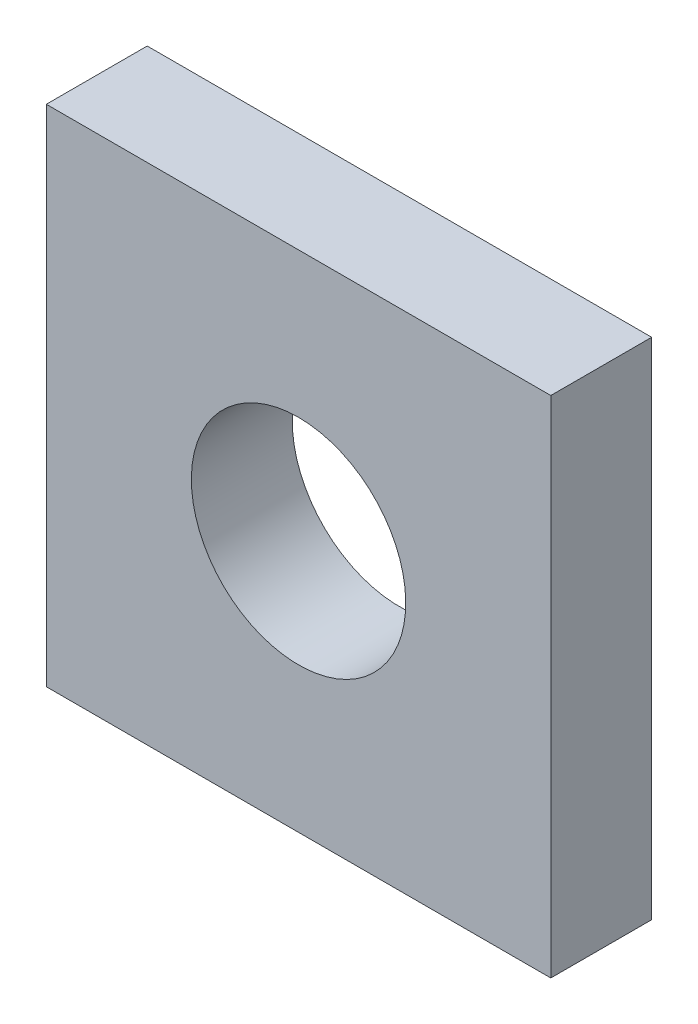
ISO-10303-21;
HEADER;
FILE_DESCRIPTION(('STEP AP214'),'2;1');
FILE_NAME('part.step','',(''),(''),'','','');
FILE_SCHEMA(('AUTOMOTIVE_DESIGN { 1 0 10303 214 1 1 1 1 }'));
ENDSEC;
DATA;
#1=APPLICATION_CONTEXT('core data for automotive mechanical design processes');
#2=APPLICATION_PROTOCOL_DEFINITION('international standard','automotive_design',2000,#1);
#3=PRODUCT_CONTEXT('',#1,'mechanical');
#4=PRODUCT('Part','Part','',(#3));
#5=PRODUCT_RELATED_PRODUCT_CATEGORY('part','',(#4));
#6=PRODUCT_DEFINITION_FORMATION('','',#4);
#7=PRODUCT_DEFINITION_CONTEXT('part definition',#1,'design');
#8=PRODUCT_DEFINITION('design','',#6,#7);
#9=PRODUCT_DEFINITION_SHAPE('','',#8);
#10=(LENGTH_UNIT() NAMED_UNIT(*) SI_UNIT(.MILLI.,.METRE.));
#11=(NAMED_UNIT(*) PLANE_ANGLE_UNIT() SI_UNIT($,.RADIAN.));
#12=(NAMED_UNIT(*) SI_UNIT($,.STERADIAN.) SOLID_ANGLE_UNIT());
#13=UNCERTAINTY_MEASURE_WITH_UNIT(LENGTH_MEASURE(1.E-05),#10,'distance_accuracy_value','');
#14=(GEOMETRIC_REPRESENTATION_CONTEXT(3) GLOBAL_UNCERTAINTY_ASSIGNED_CONTEXT((#13)) GLOBAL_UNIT_ASSIGNED_CONTEXT((#10,
#11,#12)) REPRESENTATION_CONTEXT('',''));
#15=CARTESIAN_POINT('',(0.,0.,0.));
#16=DIRECTION('',(0.,0.,1.));
#17=DIRECTION('',(1.,0.,0.));
#18=AXIS2_PLACEMENT_3D('',#15,#16,#17);
#19=CARTESIAN_POINT('',(21.,-33.5,186.3));
#20=DIRECTION('',(0.,0.,1.));
#21=DIRECTION('',(0.,1.,0.));
#22=AXIS2_PLACEMENT_3D('',#19,#20,#21);
#23=CYLINDRICAL_SURFACE('',#22,1.7);
#24=DIRECTION('',(0.,0.,1.));
#25=VECTOR('',#24,1.);
#26=CARTESIAN_POINT('',(21.,-31.8,186.3));
#27=LINE('',#26,#25);
#28=CARTESIAN_POINT('',(21.,-31.8,186.5));
#29=VERTEX_POINT('',#28);
#30=CARTESIAN_POINT('',(21.,-31.8,188.1));
#31=VERTEX_POINT('',#30);
#32=EDGE_CURVE('E9',#29,#31,#27,.T.);
#33=ORIENTED_EDGE('',*,*,#32,.F.);
#34=CARTESIAN_POINT('',(21.,-33.5,186.5));
#35=DIRECTION('',(0.,0.,1.));
#36=DIRECTION('',(0.,1.,0.));
#37=AXIS2_PLACEMENT_3D('',#34,#35,#36);
#38=CIRCLE('',#37,1.7);
#39=EDGE_CURVE('E25',#29,#29,#38,.T.);
#40=ORIENTED_EDGE('',*,*,#39,.F.);
#41=ORIENTED_EDGE('',*,*,#32,.T.);
#42=CARTESIAN_POINT('',(21.,-33.5,188.1));
#43=DIRECTION('',(0.,0.,1.));
#44=DIRECTION('',(0.,1.,0.));
#45=AXIS2_PLACEMENT_3D('',#42,#43,#44);
#46=CIRCLE('',#45,1.7);
#47=EDGE_CURVE('E90',#31,#31,#46,.T.);
#48=ORIENTED_EDGE('',*,*,#47,.T.);
#49=EDGE_LOOP('',(#33,#40,#41,#48));
#50=FACE_BOUND('',#49,.T.);
#51=ADVANCED_FACE('F14',(#50),#23,.F.);
#52=CARTESIAN_POINT('',(25.,-29.5,186.5));
#53=DIRECTION('',(0.,1.,0.));
#54=DIRECTION('',(1.,0.,0.));
#55=AXIS2_PLACEMENT_3D('',#52,#53,#54);
#56=PLANE('',#55);
#57=DIRECTION('',(0.,0.,1.));
#58=VECTOR('',#57,1.);
#59=CARTESIAN_POINT('',(25.,-29.5,186.5));
#60=LINE('',#59,#58);
#61=CARTESIAN_POINT('',(25.,-29.5,186.5));
#62=VERTEX_POINT('',#61);
#63=CARTESIAN_POINT('',(25.,-29.5,188.1));
#64=VERTEX_POINT('',#63);
#65=EDGE_CURVE('E118',#62,#64,#60,.T.);
#66=ORIENTED_EDGE('',*,*,#65,.F.);
#67=DIRECTION('',(-1.,0.,0.));
#68=VECTOR('',#67,1.);
#69=CARTESIAN_POINT('',(25.,-29.5,186.5));
#70=LINE('',#69,#68);
#71=CARTESIAN_POINT('',(17.,-29.5,186.5));
#72=VERTEX_POINT('',#71);
#73=EDGE_CURVE('E115',#62,#72,#70,.T.);
#74=ORIENTED_EDGE('',*,*,#73,.T.);
#75=DIRECTION('',(0.,0.,1.));
#76=VECTOR('',#75,1.);
#77=CARTESIAN_POINT('',(17.,-29.5,186.5));
#78=LINE('',#77,#76);
#79=CARTESIAN_POINT('',(17.,-29.5,188.1));
#80=VERTEX_POINT('',#79);
#81=EDGE_CURVE('E87',#72,#80,#78,.T.);
#82=ORIENTED_EDGE('',*,*,#81,.T.);
#83=DIRECTION('',(-1.,0.,0.));
#84=VECTOR('',#83,1.);
#85=CARTESIAN_POINT('',(25.,-29.5,188.1));
#86=LINE('',#85,#84);
#87=EDGE_CURVE('E129',#64,#80,#86,.T.);
#88=ORIENTED_EDGE('',*,*,#87,.F.);
#89=EDGE_LOOP('',(#66,#74,#82,#88));
#90=FACE_BOUND('',#89,.T.);
#91=ADVANCED_FACE('F140',(#90),#56,.T.);
#92=CARTESIAN_POINT('',(25.,-37.5,186.5));
#93=DIRECTION('',(0.,0.,1.));
#94=DIRECTION('',(1.,0.,0.));
#95=AXIS2_PLACEMENT_3D('',#92,#93,#94);
#96=PLANE('',#95);
#97=ORIENTED_EDGE('',*,*,#39,.T.);
#98=EDGE_LOOP('',(#97));
#99=FACE_BOUND('',#98,.T.);
#100=DIRECTION('',(0.,1.,0.));
#101=VECTOR('',#100,1.);
#102=CARTESIAN_POINT('',(17.,-37.5,186.5));
#103=LINE('',#102,#101);
#104=CARTESIAN_POINT('',(17.,-37.5,186.5));
#105=VERTEX_POINT('',#104);
#106=EDGE_CURVE('E81',#105,#72,#103,.T.);
#107=ORIENTED_EDGE('',*,*,#106,.T.);
#108=ORIENTED_EDGE('',*,*,#73,.F.);
#109=DIRECTION('',(0.,1.,0.));
#110=VECTOR('',#109,1.);
#111=CARTESIAN_POINT('',(25.,-37.5,186.5));
#112=LINE('',#111,#110);
#113=CARTESIAN_POINT('',(25.,-37.5,186.5));
#114=VERTEX_POINT('',#113);
#115=EDGE_CURVE('E96',#114,#62,#112,.T.);
#116=ORIENTED_EDGE('',*,*,#115,.F.);
#117=DIRECTION('',(-1.,0.,0.));
#118=VECTOR('',#117,1.);
#119=CARTESIAN_POINT('',(25.,-37.5,186.5));
#120=LINE('',#119,#118);
#121=EDGE_CURVE('E93',#114,#105,#120,.T.);
#122=ORIENTED_EDGE('',*,*,#121,.T.);
#123=EDGE_LOOP('',(#107,#108,#116,#122));
#124=FACE_BOUND('',#123,.T.);
#125=ADVANCED_FACE('F94',(#99,#124),#96,.F.);
#126=CARTESIAN_POINT('',(17.,-37.5,186.5));
#127=DIRECTION('',(-1.,0.,0.));
#128=DIRECTION('',(0.,0.,1.));
#129=AXIS2_PLACEMENT_3D('',#126,#127,#128);
#130=PLANE('',#129);
#131=ORIENTED_EDGE('',*,*,#106,.F.);
#132=DIRECTION('',(0.,0.,1.));
#133=VECTOR('',#132,1.);
#134=CARTESIAN_POINT('',(17.,-37.5,186.5));
#135=LINE('',#134,#133);
#136=CARTESIAN_POINT('',(17.,-37.5,188.1));
#137=VERTEX_POINT('',#136);
#138=EDGE_CURVE('E85',#105,#137,#135,.T.);
#139=ORIENTED_EDGE('',*,*,#138,.T.);
#140=DIRECTION('',(0.,1.,0.));
#141=VECTOR('',#140,1.);
#142=CARTESIAN_POINT('',(17.,-37.5,188.1));
#143=LINE('',#142,#141);
#144=EDGE_CURVE('E73',#137,#80,#143,.T.);
#145=ORIENTED_EDGE('',*,*,#144,.T.);
#146=ORIENTED_EDGE('',*,*,#81,.F.);
#147=EDGE_LOOP('',(#131,#139,#145,#146));
#148=FACE_BOUND('',#147,.T.);
#149=ADVANCED_FACE('F83',(#148),#130,.T.);
#150=CARTESIAN_POINT('',(25.,-37.5,188.1));
#151=DIRECTION('',(0.,0.,1.));
#152=DIRECTION('',(1.,0.,0.));
#153=AXIS2_PLACEMENT_3D('',#150,#151,#152);
#154=PLANE('',#153);
#155=ORIENTED_EDGE('',*,*,#47,.F.);
#156=EDGE_LOOP('',(#155));
#157=FACE_BOUND('',#156,.T.);
#158=DIRECTION('',(-1.,0.,0.));
#159=VECTOR('',#158,1.);
#160=CARTESIAN_POINT('',(25.,-37.5,188.1));
#161=LINE('',#160,#159);
#162=CARTESIAN_POINT('',(25.,-37.5,188.1));
#163=VERTEX_POINT('',#162);
#164=EDGE_CURVE('E104',#163,#137,#161,.T.);
#165=ORIENTED_EDGE('',*,*,#164,.F.);
#166=DIRECTION('',(0.,1.,0.));
#167=VECTOR('',#166,1.);
#168=CARTESIAN_POINT('',(25.,-37.5,188.1));
#169=LINE('',#168,#167);
#170=EDGE_CURVE('E18',#163,#64,#169,.T.);
#171=ORIENTED_EDGE('',*,*,#170,.T.);
#172=ORIENTED_EDGE('',*,*,#87,.T.);
#173=ORIENTED_EDGE('',*,*,#144,.F.);
#174=EDGE_LOOP('',(#165,#171,#172,#173));
#175=FACE_BOUND('',#174,.T.);
#176=ADVANCED_FACE('F142',(#157,#175),#154,.T.);
#177=CARTESIAN_POINT('',(25.,-37.5,186.5));
#178=DIRECTION('',(-1.,0.,0.));
#179=DIRECTION('',(0.,0.,1.));
#180=AXIS2_PLACEMENT_3D('',#177,#178,#179);
#181=PLANE('',#180);
#182=ORIENTED_EDGE('',*,*,#65,.T.);
#183=ORIENTED_EDGE('',*,*,#170,.F.);
#184=DIRECTION('',(0.,0.,1.));
#185=VECTOR('',#184,1.);
#186=CARTESIAN_POINT('',(25.,-37.5,186.5));
#187=LINE('',#186,#185);
#188=EDGE_CURVE('E101',#114,#163,#187,.T.);
#189=ORIENTED_EDGE('',*,*,#188,.F.);
#190=ORIENTED_EDGE('',*,*,#115,.T.);
#191=EDGE_LOOP('',(#182,#183,#189,#190));
#192=FACE_BOUND('',#191,.T.);
#193=ADVANCED_FACE('F16',(#192),#181,.F.);
#194=CARTESIAN_POINT('',(25.,-37.5,186.5));
#195=DIRECTION('',(0.,1.,0.));
#196=DIRECTION('',(1.,0.,0.));
#197=AXIS2_PLACEMENT_3D('',#194,#195,#196);
#198=PLANE('',#197);
#199=ORIENTED_EDGE('',*,*,#164,.T.);
#200=ORIENTED_EDGE('',*,*,#138,.F.);
#201=ORIENTED_EDGE('',*,*,#121,.F.);
#202=ORIENTED_EDGE('',*,*,#188,.T.);
#203=EDGE_LOOP('',(#199,#200,#201,#202));
#204=FACE_BOUND('',#203,.T.);
#205=ADVANCED_FACE('F103',(#204),#198,.F.);
#206=CLOSED_SHELL('',(#51,#91,#125,#149,#176,#193,#205));
#207=MANIFOLD_SOLID_BREP('B1',#206);
#208=ADVANCED_BREP_SHAPE_REPRESENTATION('',(#18,#207),#14);
#209=SHAPE_DEFINITION_REPRESENTATION(#9,#208);
ENDSEC;
END-ISO-10303-21;
